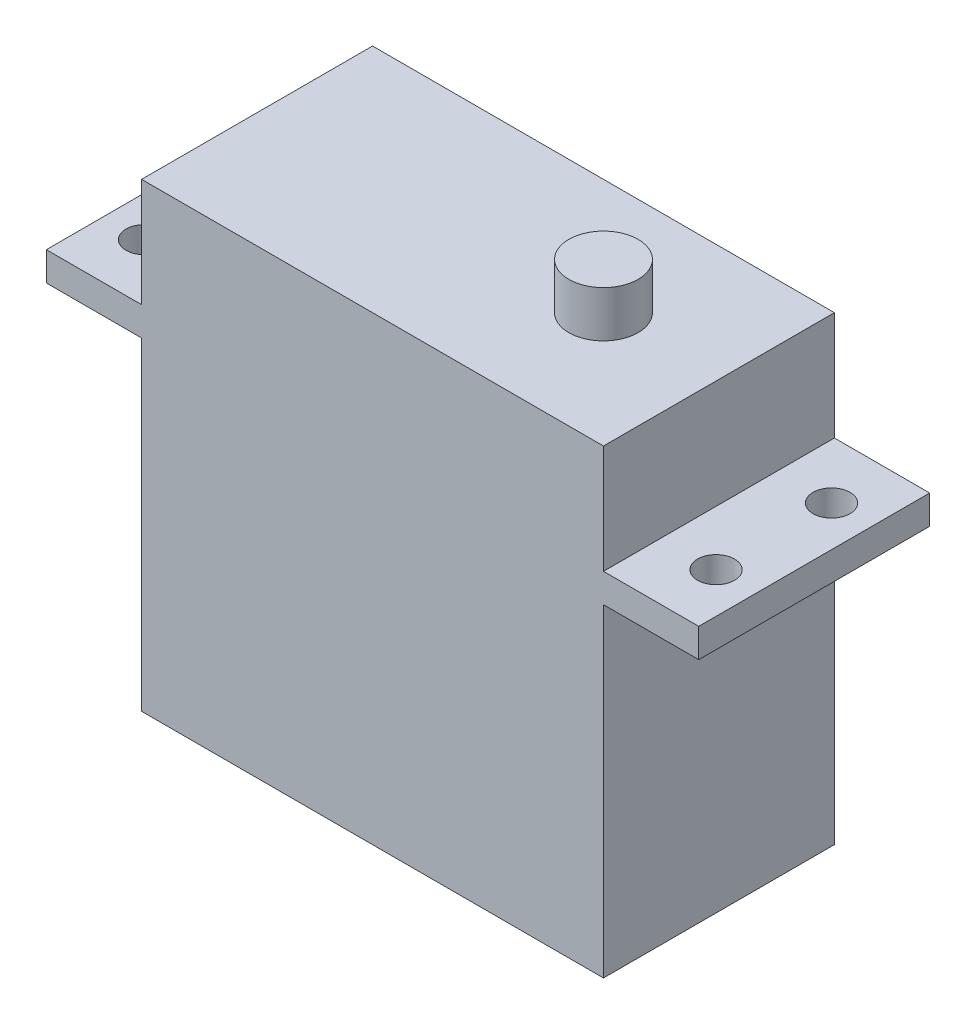
ISO-10303-21;
HEADER;
FILE_DESCRIPTION(('STEP AP214'),'2;1');
FILE_NAME('part.step','',(''),(''),'','','');
FILE_SCHEMA(('AUTOMOTIVE_DESIGN { 1 0 10303 214 1 1 1 1 }'));
ENDSEC;
DATA;
#1=APPLICATION_CONTEXT('core data for automotive mechanical design processes');
#2=APPLICATION_PROTOCOL_DEFINITION('international standard','automotive_design',2000,#1);
#3=PRODUCT_CONTEXT('',#1,'mechanical');
#4=PRODUCT('Part','Part','',(#3));
#5=PRODUCT_RELATED_PRODUCT_CATEGORY('part','',(#4));
#6=PRODUCT_DEFINITION_FORMATION('','',#4);
#7=PRODUCT_DEFINITION_CONTEXT('part definition',#1,'design');
#8=PRODUCT_DEFINITION('design','',#6,#7);
#9=PRODUCT_DEFINITION_SHAPE('','',#8);
#10=(LENGTH_UNIT() NAMED_UNIT(*) SI_UNIT(.MILLI.,.METRE.));
#11=(NAMED_UNIT(*) PLANE_ANGLE_UNIT() SI_UNIT($,.RADIAN.));
#12=(NAMED_UNIT(*) SI_UNIT($,.STERADIAN.) SOLID_ANGLE_UNIT());
#13=UNCERTAINTY_MEASURE_WITH_UNIT(LENGTH_MEASURE(1.E-05),#10,'distance_accuracy_value','');
#14=(GEOMETRIC_REPRESENTATION_CONTEXT(3) GLOBAL_UNCERTAINTY_ASSIGNED_CONTEXT((#13)) GLOBAL_UNIT_ASSIGNED_CONTEXT((#10,
#11,#12)) REPRESENTATION_CONTEXT('',''));
#15=CARTESIAN_POINT('',(0.,0.,0.));
#16=DIRECTION('',(0.,0.,1.));
#17=DIRECTION('',(1.,0.,0.));
#18=AXIS2_PLACEMENT_3D('',#15,#16,#17);
#19=CARTESIAN_POINT('',(-30.,57.5,34.));
#20=DIRECTION('',(1.,0.,0.));
#21=DIRECTION('',(0.,0.,-1.));
#22=AXIS2_PLACEMENT_3D('',#19,#20,#21);
#23=PLANE('',#22);
#24=DIRECTION('',(0.,0.,-1.));
#25=VECTOR('',#24,1.);
#26=CARTESIAN_POINT('',(-30.,48.1,34.));
#27=LINE('',#26,#25);
#28=CARTESIAN_POINT('',(-30.,48.1,34.));
#29=VERTEX_POINT('',#28);
#30=CARTESIAN_POINT('',(-30.,48.1,14.));
#31=VERTEX_POINT('',#30);
#32=EDGE_CURVE('E157',#29,#31,#27,.T.);
#33=ORIENTED_EDGE('',*,*,#32,.F.);
#34=DIRECTION('',(0.,-1.,0.));
#35=VECTOR('',#34,1.);
#36=CARTESIAN_POINT('',(-30.,57.5,34.));
#37=LINE('',#36,#35);
#38=CARTESIAN_POINT('',(-30.,57.5,34.));
#39=VERTEX_POINT('',#38);
#40=EDGE_CURVE('E183',#39,#29,#37,.T.);
#41=ORIENTED_EDGE('',*,*,#40,.F.);
#42=DIRECTION('',(0.,0.,-1.));
#43=VECTOR('',#42,1.);
#44=CARTESIAN_POINT('',(-30.,57.5,34.));
#45=LINE('',#44,#43);
#46=CARTESIAN_POINT('',(-30.,57.5,14.));
#47=VERTEX_POINT('',#46);
#48=EDGE_CURVE('E192',#39,#47,#45,.T.);
#49=ORIENTED_EDGE('',*,*,#48,.T.);
#50=DIRECTION('',(0.,-1.,0.));
#51=VECTOR('',#50,1.);
#52=CARTESIAN_POINT('',(-30.,57.5,14.));
#53=LINE('',#52,#51);
#54=EDGE_CURVE('E160',#47,#31,#53,.T.);
#55=ORIENTED_EDGE('',*,*,#54,.T.);
#56=EDGE_LOOP('',(#33,#41,#49,#55));
#57=FACE_BOUND('',#56,.T.);
#58=ADVANCED_FACE('F41',(#57),#23,.F.);
#59=CARTESIAN_POINT('',(10.,17.6,34.));
#60=DIRECTION('',(-1.,0.,0.));
#61=DIRECTION('',(0.,0.,1.));
#62=AXIS2_PLACEMENT_3D('',#59,#60,#61);
#63=PLANE('',#62);
#64=DIRECTION('',(0.,0.,-1.));
#65=VECTOR('',#64,1.);
#66=CARTESIAN_POINT('',(10.,45.6,34.));
#67=LINE('',#66,#65);
#68=CARTESIAN_POINT('',(10.,45.6,34.));
#69=VERTEX_POINT('',#68);
#70=CARTESIAN_POINT('',(10.,45.6,14.));
#71=VERTEX_POINT('',#70);
#72=EDGE_CURVE('E162',#69,#71,#67,.T.);
#73=ORIENTED_EDGE('',*,*,#72,.F.);
#74=DIRECTION('',(0.,1.,0.));
#75=VECTOR('',#74,1.);
#76=CARTESIAN_POINT('',(10.,17.6,34.));
#77=LINE('',#76,#75);
#78=CARTESIAN_POINT('',(10.,17.6,34.));
#79=VERTEX_POINT('',#78);
#80=EDGE_CURVE('E193',#79,#69,#77,.T.);
#81=ORIENTED_EDGE('',*,*,#80,.F.);
#82=DIRECTION('',(0.,0.,-1.));
#83=VECTOR('',#82,1.);
#84=CARTESIAN_POINT('',(10.,17.6,34.));
#85=LINE('',#84,#83);
#86=CARTESIAN_POINT('',(10.,17.6,14.));
#87=VERTEX_POINT('',#86);
#88=EDGE_CURVE('E49',#79,#87,#85,.T.);
#89=ORIENTED_EDGE('',*,*,#88,.T.);
#90=DIRECTION('',(0.,1.,0.));
#91=VECTOR('',#90,1.);
#92=CARTESIAN_POINT('',(10.,17.6,14.));
#93=LINE('',#92,#91);
#94=EDGE_CURVE('E203',#87,#71,#93,.T.);
#95=ORIENTED_EDGE('',*,*,#94,.T.);
#96=EDGE_LOOP('',(#73,#81,#89,#95));
#97=FACE_BOUND('',#96,.T.);
#98=ADVANCED_FACE('F278',(#97),#63,.F.);
#99=CARTESIAN_POINT('',(-30.,45.6,34.));
#100=VERTEX_POINT('',#99);
#101=CARTESIAN_POINT('',(-30.,17.6,34.));
#102=VERTEX_POINT('',#101);
#103=EDGE_CURVE('E186',#100,#102,#37,.T.);
#104=ORIENTED_EDGE('',*,*,#103,.F.);
#105=DIRECTION('',(0.,0.,-1.));
#106=VECTOR('',#105,1.);
#107=CARTESIAN_POINT('',(-30.,45.6,34.));
#108=LINE('',#107,#106);
#109=CARTESIAN_POINT('',(-30.,45.6,14.));
#110=VERTEX_POINT('',#109);
#111=EDGE_CURVE('E136',#100,#110,#108,.T.);
#112=ORIENTED_EDGE('',*,*,#111,.T.);
#113=CARTESIAN_POINT('',(-30.,17.6,14.));
#114=VERTEX_POINT('',#113);
#115=EDGE_CURVE('E154',#110,#114,#53,.T.);
#116=ORIENTED_EDGE('',*,*,#115,.T.);
#117=DIRECTION('',(0.,0.,-1.));
#118=VECTOR('',#117,1.);
#119=CARTESIAN_POINT('',(-30.,17.6,34.));
#120=LINE('',#119,#118);
#121=EDGE_CURVE('E11',#102,#114,#120,.T.);
#122=ORIENTED_EDGE('',*,*,#121,.F.);
#123=EDGE_LOOP('',(#104,#112,#116,#122));
#124=FACE_BOUND('',#123,.T.);
#125=ADVANCED_FACE('F43',(#124),#23,.F.);
#126=CARTESIAN_POINT('',(-30.,17.6,34.));
#127=DIRECTION('',(0.,1.,0.));
#128=DIRECTION('',(0.,0.,1.));
#129=AXIS2_PLACEMENT_3D('',#126,#127,#128);
#130=PLANE('',#129);
#131=DIRECTION('',(1.,0.,0.));
#132=VECTOR('',#131,1.);
#133=CARTESIAN_POINT('',(-30.,17.6,14.));
#134=LINE('',#133,#132);
#135=EDGE_CURVE('E196',#114,#87,#134,.T.);
#136=ORIENTED_EDGE('',*,*,#135,.T.);
#137=ORIENTED_EDGE('',*,*,#88,.F.);
#138=DIRECTION('',(1.,0.,0.));
#139=VECTOR('',#138,1.);
#140=CARTESIAN_POINT('',(-30.,17.6,34.));
#141=LINE('',#140,#139);
#142=EDGE_CURVE('E190',#102,#79,#141,.T.);
#143=ORIENTED_EDGE('',*,*,#142,.F.);
#144=ORIENTED_EDGE('',*,*,#121,.T.);
#145=EDGE_LOOP('',(#136,#137,#143,#144));
#146=FACE_BOUND('',#145,.T.);
#147=ADVANCED_FACE('F282',(#146),#130,.F.);
#148=CARTESIAN_POINT('',(10.,48.1,34.));
#149=VERTEX_POINT('',#148);
#150=CARTESIAN_POINT('',(10.,57.5,34.));
#151=VERTEX_POINT('',#150);
#152=EDGE_CURVE('E189',#149,#151,#77,.T.);
#153=ORIENTED_EDGE('',*,*,#152,.F.);
#154=DIRECTION('',(0.,0.,-1.));
#155=VECTOR('',#154,1.);
#156=CARTESIAN_POINT('',(10.,48.1,34.));
#157=LINE('',#156,#155);
#158=CARTESIAN_POINT('',(10.,48.1,14.));
#159=VERTEX_POINT('',#158);
#160=EDGE_CURVE('E175',#149,#159,#157,.T.);
#161=ORIENTED_EDGE('',*,*,#160,.T.);
#162=CARTESIAN_POINT('',(10.,57.5,14.));
#163=VERTEX_POINT('',#162);
#164=EDGE_CURVE('E199',#159,#163,#93,.T.);
#165=ORIENTED_EDGE('',*,*,#164,.T.);
#166=DIRECTION('',(0.,0.,-1.));
#167=VECTOR('',#166,1.);
#168=CARTESIAN_POINT('',(10.,57.5,34.));
#169=LINE('',#168,#167);
#170=EDGE_CURVE('E208',#151,#163,#169,.T.);
#171=ORIENTED_EDGE('',*,*,#170,.F.);
#172=EDGE_LOOP('',(#153,#161,#165,#171));
#173=FACE_BOUND('',#172,.T.);
#174=ADVANCED_FACE('F264',(#173),#63,.F.);
#175=CARTESIAN_POINT('',(10.,57.5,34.));
#176=DIRECTION('',(0.,-1.,0.));
#177=DIRECTION('',(0.,0.,-1.));
#178=AXIS2_PLACEMENT_3D('',#175,#176,#177);
#179=PLANE('',#178);
#180=CARTESIAN_POINT('',(0.,57.5,24.));
#181=DIRECTION('',(0.,-1.,0.));
#182=DIRECTION('',(0.,0.,-1.));
#183=AXIS2_PLACEMENT_3D('',#180,#181,#182);
#184=CIRCLE('',#183,3.);
#185=CARTESIAN_POINT('',(0.,57.5,21.));
#186=VERTEX_POINT('',#185);
#187=EDGE_CURVE('E170',#186,#186,#184,.T.);
#188=ORIENTED_EDGE('',*,*,#187,.T.);
#189=EDGE_LOOP('',(#188));
#190=FACE_BOUND('',#189,.T.);
#191=DIRECTION('',(-1.,0.,0.));
#192=VECTOR('',#191,1.);
#193=CARTESIAN_POINT('',(10.,57.5,14.));
#194=LINE('',#193,#192);
#195=EDGE_CURVE('E204',#163,#47,#194,.T.);
#196=ORIENTED_EDGE('',*,*,#195,.T.);
#197=ORIENTED_EDGE('',*,*,#48,.F.);
#198=DIRECTION('',(-1.,0.,0.));
#199=VECTOR('',#198,1.);
#200=CARTESIAN_POINT('',(10.,57.5,34.));
#201=LINE('',#200,#199);
#202=EDGE_CURVE('E194',#151,#39,#201,.T.);
#203=ORIENTED_EDGE('',*,*,#202,.F.);
#204=ORIENTED_EDGE('',*,*,#170,.T.);
#205=EDGE_LOOP('',(#196,#197,#203,#204));
#206=FACE_BOUND('',#205,.T.);
#207=ADVANCED_FACE('F259',(#190,#206),#179,.F.);
#208=CARTESIAN_POINT('',(0.,0.,34.));
#209=DIRECTION('',(0.,0.,1.));
#210=DIRECTION('',(1.,0.,0.));
#211=AXIS2_PLACEMENT_3D('',#208,#209,#210);
#212=PLANE('',#211);
#213=ORIENTED_EDGE('',*,*,#40,.T.);
#214=DIRECTION('',(-1.,0.,0.));
#215=VECTOR('',#214,1.);
#216=CARTESIAN_POINT('',(-30.,48.1,34.));
#217=LINE('',#216,#215);
#218=CARTESIAN_POINT('',(-38.25,48.1,34.));
#219=VERTEX_POINT('',#218);
#220=EDGE_CURVE('E143',#29,#219,#217,.T.);
#221=ORIENTED_EDGE('',*,*,#220,.T.);
#222=DIRECTION('',(0.,-1.,0.));
#223=VECTOR('',#222,1.);
#224=CARTESIAN_POINT('',(-38.25,48.1,34.));
#225=LINE('',#224,#223);
#226=CARTESIAN_POINT('',(-38.25,45.6,34.));
#227=VERTEX_POINT('',#226);
#228=EDGE_CURVE('E142',#219,#227,#225,.T.);
#229=ORIENTED_EDGE('',*,*,#228,.T.);
#230=DIRECTION('',(1.,0.,0.));
#231=VECTOR('',#230,1.);
#232=CARTESIAN_POINT('',(-38.25,45.6,34.));
#233=LINE('',#232,#231);
#234=EDGE_CURVE('E135',#227,#100,#233,.T.);
#235=ORIENTED_EDGE('',*,*,#234,.T.);
#236=ORIENTED_EDGE('',*,*,#103,.T.);
#237=ORIENTED_EDGE('',*,*,#142,.T.);
#238=ORIENTED_EDGE('',*,*,#80,.T.);
#239=DIRECTION('',(1.,0.,0.));
#240=VECTOR('',#239,1.);
#241=CARTESIAN_POINT('',(10.,45.6,34.));
#242=LINE('',#241,#240);
#243=CARTESIAN_POINT('',(18.25,45.6,34.));
#244=VERTEX_POINT('',#243);
#245=EDGE_CURVE('E180',#69,#244,#242,.T.);
#246=ORIENTED_EDGE('',*,*,#245,.T.);
#247=DIRECTION('',(0.,1.,0.));
#248=VECTOR('',#247,1.);
#249=CARTESIAN_POINT('',(18.25,45.6,34.));
#250=LINE('',#249,#248);
#251=CARTESIAN_POINT('',(18.25,48.1,34.));
#252=VERTEX_POINT('',#251);
#253=EDGE_CURVE('E185',#244,#252,#250,.T.);
#254=ORIENTED_EDGE('',*,*,#253,.T.);
#255=DIRECTION('',(-1.,0.,0.));
#256=VECTOR('',#255,1.);
#257=CARTESIAN_POINT('',(18.25,48.1,34.));
#258=LINE('',#257,#256);
#259=EDGE_CURVE('E172',#252,#149,#258,.T.);
#260=ORIENTED_EDGE('',*,*,#259,.T.);
#261=ORIENTED_EDGE('',*,*,#152,.T.);
#262=ORIENTED_EDGE('',*,*,#202,.T.);
#263=EDGE_LOOP('',(#213,#221,#229,#235,#236,#237,#238,#246,#254,#260,#261,#262));
#264=FACE_BOUND('',#263,.T.);
#265=ADVANCED_FACE('F148',(#264),#212,.T.);
#266=CARTESIAN_POINT('',(0.,0.,14.));
#267=DIRECTION('',(0.,0.,1.));
#268=DIRECTION('',(1.,0.,0.));
#269=AXIS2_PLACEMENT_3D('',#266,#267,#268);
#270=PLANE('',#269);
#271=ORIENTED_EDGE('',*,*,#54,.F.);
#272=ORIENTED_EDGE('',*,*,#195,.F.);
#273=ORIENTED_EDGE('',*,*,#164,.F.);
#274=DIRECTION('',(-1.,0.,0.));
#275=VECTOR('',#274,1.);
#276=CARTESIAN_POINT('',(18.25,48.1,14.));
#277=LINE('',#276,#275);
#278=CARTESIAN_POINT('',(18.25,48.1,14.));
#279=VERTEX_POINT('',#278);
#280=EDGE_CURVE('E68',#279,#159,#277,.T.);
#281=ORIENTED_EDGE('',*,*,#280,.F.);
#282=DIRECTION('',(0.,1.,0.));
#283=VECTOR('',#282,1.);
#284=CARTESIAN_POINT('',(18.25,45.6,14.));
#285=LINE('',#284,#283);
#286=CARTESIAN_POINT('',(18.25,45.6,14.));
#287=VERTEX_POINT('',#286);
#288=EDGE_CURVE('E178',#287,#279,#285,.T.);
#289=ORIENTED_EDGE('',*,*,#288,.F.);
#290=DIRECTION('',(1.,0.,0.));
#291=VECTOR('',#290,1.);
#292=CARTESIAN_POINT('',(10.,45.6,14.));
#293=LINE('',#292,#291);
#294=EDGE_CURVE('E179',#71,#287,#293,.T.);
#295=ORIENTED_EDGE('',*,*,#294,.F.);
#296=ORIENTED_EDGE('',*,*,#94,.F.);
#297=ORIENTED_EDGE('',*,*,#135,.F.);
#298=ORIENTED_EDGE('',*,*,#115,.F.);
#299=DIRECTION('',(1.,0.,0.));
#300=VECTOR('',#299,1.);
#301=CARTESIAN_POINT('',(-38.25,45.6,14.));
#302=LINE('',#301,#300);
#303=CARTESIAN_POINT('',(-38.25,45.6,14.));
#304=VERTEX_POINT('',#303);
#305=EDGE_CURVE('E59',#304,#110,#302,.T.);
#306=ORIENTED_EDGE('',*,*,#305,.F.);
#307=DIRECTION('',(0.,-1.,0.));
#308=VECTOR('',#307,1.);
#309=CARTESIAN_POINT('',(-38.25,48.1,14.));
#310=LINE('',#309,#308);
#311=CARTESIAN_POINT('',(-38.25,48.1,14.));
#312=VERTEX_POINT('',#311);
#313=EDGE_CURVE('E152',#312,#304,#310,.T.);
#314=ORIENTED_EDGE('',*,*,#313,.F.);
#315=DIRECTION('',(-1.,0.,0.));
#316=VECTOR('',#315,1.);
#317=CARTESIAN_POINT('',(-30.,48.1,14.));
#318=LINE('',#317,#316);
#319=EDGE_CURVE('E147',#31,#312,#318,.T.);
#320=ORIENTED_EDGE('',*,*,#319,.F.);
#321=EDGE_LOOP('',(#271,#272,#273,#281,#289,#295,#296,#297,#298,#306,#314,#320));
#322=FACE_BOUND('',#321,.T.);
#323=ADVANCED_FACE('F255',(#322),#270,.F.);
#324=CARTESIAN_POINT('',(10.,45.6,34.));
#325=DIRECTION('',(0.,1.,0.));
#326=DIRECTION('',(0.,0.,1.));
#327=AXIS2_PLACEMENT_3D('',#324,#325,#326);
#328=PLANE('',#327);
#329=CARTESIAN_POINT('',(14.75,45.6,19.));
#330=DIRECTION('',(0.,1.,0.));
#331=DIRECTION('',(0.,0.,1.));
#332=AXIS2_PLACEMENT_3D('',#329,#330,#331);
#333=CIRCLE('',#332,1.6);
#334=CARTESIAN_POINT('',(14.75,45.6,20.6));
#335=VERTEX_POINT('',#334);
#336=EDGE_CURVE('E231',#335,#335,#333,.T.);
#337=ORIENTED_EDGE('',*,*,#336,.T.);
#338=EDGE_LOOP('',(#337));
#339=FACE_BOUND('',#338,.T.);
#340=CARTESIAN_POINT('',(14.75,45.6,29.));
#341=DIRECTION('',(0.,1.,0.));
#342=DIRECTION('',(0.,0.,1.));
#343=AXIS2_PLACEMENT_3D('',#340,#341,#342);
#344=CIRCLE('',#343,1.6);
#345=CARTESIAN_POINT('',(14.75,45.6,30.6));
#346=VERTEX_POINT('',#345);
#347=EDGE_CURVE('E225',#346,#346,#344,.T.);
#348=ORIENTED_EDGE('',*,*,#347,.T.);
#349=EDGE_LOOP('',(#348));
#350=FACE_BOUND('',#349,.T.);
#351=ORIENTED_EDGE('',*,*,#294,.T.);
#352=DIRECTION('',(0.,0.,-1.));
#353=VECTOR('',#352,1.);
#354=CARTESIAN_POINT('',(18.25,45.6,34.));
#355=LINE('',#354,#353);
#356=EDGE_CURVE('E167',#244,#287,#355,.T.);
#357=ORIENTED_EDGE('',*,*,#356,.F.);
#358=ORIENTED_EDGE('',*,*,#245,.F.);
#359=ORIENTED_EDGE('',*,*,#72,.T.);
#360=EDGE_LOOP('',(#351,#357,#358,#359));
#361=FACE_BOUND('',#360,.T.);
#362=ADVANCED_FACE('F280',(#339,#350,#361),#328,.F.);
#363=CARTESIAN_POINT('',(18.25,45.6,34.));
#364=DIRECTION('',(-1.,0.,0.));
#365=DIRECTION('',(0.,0.,1.));
#366=AXIS2_PLACEMENT_3D('',#363,#364,#365);
#367=PLANE('',#366);
#368=ORIENTED_EDGE('',*,*,#288,.T.);
#369=DIRECTION('',(0.,0.,-1.));
#370=VECTOR('',#369,1.);
#371=CARTESIAN_POINT('',(18.25,48.1,34.));
#372=LINE('',#371,#370);
#373=EDGE_CURVE('E168',#252,#279,#372,.T.);
#374=ORIENTED_EDGE('',*,*,#373,.F.);
#375=ORIENTED_EDGE('',*,*,#253,.F.);
#376=ORIENTED_EDGE('',*,*,#356,.T.);
#377=EDGE_LOOP('',(#368,#374,#375,#376));
#378=FACE_BOUND('',#377,.T.);
#379=ADVANCED_FACE('F275',(#378),#367,.F.);
#380=CARTESIAN_POINT('',(18.25,48.1,34.));
#381=DIRECTION('',(0.,-1.,0.));
#382=DIRECTION('',(0.,0.,-1.));
#383=AXIS2_PLACEMENT_3D('',#380,#381,#382);
#384=PLANE('',#383);
#385=CARTESIAN_POINT('',(14.75,48.1,19.));
#386=DIRECTION('',(0.,-1.,0.));
#387=DIRECTION('',(0.,0.,-1.));
#388=AXIS2_PLACEMENT_3D('',#385,#386,#387);
#389=CIRCLE('',#388,1.6);
#390=CARTESIAN_POINT('',(14.75,48.1,17.4));
#391=VERTEX_POINT('',#390);
#392=EDGE_CURVE('E44',#391,#391,#389,.T.);
#393=ORIENTED_EDGE('',*,*,#392,.T.);
#394=EDGE_LOOP('',(#393));
#395=FACE_BOUND('',#394,.T.);
#396=CARTESIAN_POINT('',(14.75,48.1,29.));
#397=DIRECTION('',(0.,-1.,0.));
#398=DIRECTION('',(0.,0.,-1.));
#399=AXIS2_PLACEMENT_3D('',#396,#397,#398);
#400=CIRCLE('',#399,1.6);
#401=CARTESIAN_POINT('',(14.75,48.1,27.4));
#402=VERTEX_POINT('',#401);
#403=EDGE_CURVE('E219',#402,#402,#400,.T.);
#404=ORIENTED_EDGE('',*,*,#403,.T.);
#405=EDGE_LOOP('',(#404));
#406=FACE_BOUND('',#405,.T.);
#407=ORIENTED_EDGE('',*,*,#280,.T.);
#408=ORIENTED_EDGE('',*,*,#160,.F.);
#409=ORIENTED_EDGE('',*,*,#259,.F.);
#410=ORIENTED_EDGE('',*,*,#373,.T.);
#411=EDGE_LOOP('',(#407,#408,#409,#410));
#412=FACE_BOUND('',#411,.T.);
#413=ADVANCED_FACE('F270',(#395,#406,#412),#384,.F.);
#414=CARTESIAN_POINT('',(-38.25,48.1,34.));
#415=DIRECTION('',(1.,0.,0.));
#416=DIRECTION('',(0.,0.,-1.));
#417=AXIS2_PLACEMENT_3D('',#414,#415,#416);
#418=PLANE('',#417);
#419=ORIENTED_EDGE('',*,*,#313,.T.);
#420=DIRECTION('',(0.,0.,-1.));
#421=VECTOR('',#420,1.);
#422=CARTESIAN_POINT('',(-38.25,45.6,34.));
#423=LINE('',#422,#421);
#424=EDGE_CURVE('E138',#227,#304,#423,.T.);
#425=ORIENTED_EDGE('',*,*,#424,.F.);
#426=ORIENTED_EDGE('',*,*,#228,.F.);
#427=DIRECTION('',(0.,0.,-1.));
#428=VECTOR('',#427,1.);
#429=CARTESIAN_POINT('',(-38.25,48.1,34.));
#430=LINE('',#429,#428);
#431=EDGE_CURVE('E245',#219,#312,#430,.T.);
#432=ORIENTED_EDGE('',*,*,#431,.T.);
#433=EDGE_LOOP('',(#419,#425,#426,#432));
#434=FACE_BOUND('',#433,.T.);
#435=ADVANCED_FACE('F155',(#434),#418,.F.);
#436=CARTESIAN_POINT('',(-38.25,45.6,34.));
#437=DIRECTION('',(0.,1.,0.));
#438=DIRECTION('',(0.,0.,1.));
#439=AXIS2_PLACEMENT_3D('',#436,#437,#438);
#440=PLANE('',#439);
#441=CARTESIAN_POINT('',(-34.75,45.6,29.));
#442=DIRECTION('',(0.,1.,0.));
#443=DIRECTION('',(0.,0.,1.));
#444=AXIS2_PLACEMENT_3D('',#441,#442,#443);
#445=CIRCLE('',#444,1.6);
#446=CARTESIAN_POINT('',(-34.75,45.6,30.6));
#447=VERTEX_POINT('',#446);
#448=EDGE_CURVE('E218',#447,#447,#445,.T.);
#449=ORIENTED_EDGE('',*,*,#448,.T.);
#450=EDGE_LOOP('',(#449));
#451=FACE_BOUND('',#450,.T.);
#452=CARTESIAN_POINT('',(-34.75,45.6,19.));
#453=DIRECTION('',(0.,1.,0.));
#454=DIRECTION('',(0.,0.,1.));
#455=AXIS2_PLACEMENT_3D('',#452,#453,#454);
#456=CIRCLE('',#455,1.6);
#457=CARTESIAN_POINT('',(-34.75,45.6,20.6));
#458=VERTEX_POINT('',#457);
#459=EDGE_CURVE('E216',#458,#458,#456,.T.);
#460=ORIENTED_EDGE('',*,*,#459,.T.);
#461=EDGE_LOOP('',(#460));
#462=FACE_BOUND('',#461,.T.);
#463=ORIENTED_EDGE('',*,*,#305,.T.);
#464=ORIENTED_EDGE('',*,*,#111,.F.);
#465=ORIENTED_EDGE('',*,*,#234,.F.);
#466=ORIENTED_EDGE('',*,*,#424,.T.);
#467=EDGE_LOOP('',(#463,#464,#465,#466));
#468=FACE_BOUND('',#467,.T.);
#469=ADVANCED_FACE('F132',(#451,#462,#468),#440,.F.);
#470=CARTESIAN_POINT('',(-30.,48.1,34.));
#471=DIRECTION('',(0.,-1.,0.));
#472=DIRECTION('',(0.,0.,-1.));
#473=AXIS2_PLACEMENT_3D('',#470,#471,#472);
#474=PLANE('',#473);
#475=CARTESIAN_POINT('',(-34.75,48.1,29.));
#476=DIRECTION('',(0.,-1.,0.));
#477=DIRECTION('',(0.,0.,-1.));
#478=AXIS2_PLACEMENT_3D('',#475,#476,#477);
#479=CIRCLE('',#478,1.6);
#480=CARTESIAN_POINT('',(-34.75,48.1,27.4));
#481=VERTEX_POINT('',#480);
#482=EDGE_CURVE('E220',#481,#481,#479,.T.);
#483=ORIENTED_EDGE('',*,*,#482,.T.);
#484=EDGE_LOOP('',(#483));
#485=FACE_BOUND('',#484,.T.);
#486=CARTESIAN_POINT('',(-34.75,48.1,19.));
#487=DIRECTION('',(0.,-1.,0.));
#488=DIRECTION('',(0.,0.,-1.));
#489=AXIS2_PLACEMENT_3D('',#486,#487,#488);
#490=CIRCLE('',#489,1.6);
#491=CARTESIAN_POINT('',(-34.75,48.1,17.4));
#492=VERTEX_POINT('',#491);
#493=EDGE_CURVE('E213',#492,#492,#490,.T.);
#494=ORIENTED_EDGE('',*,*,#493,.T.);
#495=EDGE_LOOP('',(#494));
#496=FACE_BOUND('',#495,.T.);
#497=ORIENTED_EDGE('',*,*,#319,.T.);
#498=ORIENTED_EDGE('',*,*,#431,.F.);
#499=ORIENTED_EDGE('',*,*,#220,.F.);
#500=ORIENTED_EDGE('',*,*,#32,.T.);
#501=EDGE_LOOP('',(#497,#498,#499,#500));
#502=FACE_BOUND('',#501,.T.);
#503=ADVANCED_FACE('F249',(#485,#496,#502),#474,.F.);
#504=CARTESIAN_POINT('',(0.,-100.,24.));
#505=DIRECTION('',(0.,-1.,0.));
#506=DIRECTION('',(0.,0.,-1.));
#507=AXIS2_PLACEMENT_3D('',#504,#505,#506);
#508=CYLINDRICAL_SURFACE('',#507,3.);
#509=CARTESIAN_POINT('',(0.,61.5,24.));
#510=DIRECTION('',(0.,-1.,0.));
#511=DIRECTION('',(0.,0.,-1.));
#512=AXIS2_PLACEMENT_3D('',#509,#510,#511);
#513=CIRCLE('',#512,3.);
#514=CARTESIAN_POINT('',(0.,61.5,21.));
#515=VERTEX_POINT('',#514);
#516=EDGE_CURVE('E237',#515,#515,#513,.T.);
#517=ORIENTED_EDGE('',*,*,#516,.T.);
#518=EDGE_LOOP('',(#517));
#519=FACE_BOUND('',#518,.T.);
#520=ORIENTED_EDGE('',*,*,#187,.F.);
#521=EDGE_LOOP('',(#520));
#522=FACE_BOUND('',#521,.T.);
#523=ADVANCED_FACE('F398',(#519,#522),#508,.T.);
#524=CARTESIAN_POINT('',(3.,61.5,24.));
#525=DIRECTION('',(0.,1.,0.));
#526=DIRECTION('',(0.,0.,1.));
#527=AXIS2_PLACEMENT_3D('',#524,#525,#526);
#528=PLANE('',#527);
#529=ORIENTED_EDGE('',*,*,#516,.F.);
#530=EDGE_LOOP('',(#529));
#531=FACE_BOUND('',#530,.T.);
#532=ADVANCED_FACE('F408',(#531),#528,.T.);
#533=CARTESIAN_POINT('',(-34.75,-53.1,19.));
#534=DIRECTION('',(0.,1.,0.));
#535=DIRECTION('',(0.,0.,1.));
#536=AXIS2_PLACEMENT_3D('',#533,#534,#535);
#537=CYLINDRICAL_SURFACE('',#536,1.6);
#538=ORIENTED_EDGE('',*,*,#493,.F.);
#539=EDGE_LOOP('',(#538));
#540=FACE_BOUND('',#539,.T.);
#541=ORIENTED_EDGE('',*,*,#459,.F.);
#542=EDGE_LOOP('',(#541));
#543=FACE_BOUND('',#542,.T.);
#544=ADVANCED_FACE('F418',(#540,#543),#537,.F.);
#545=CARTESIAN_POINT('',(-34.75,-53.1,29.));
#546=DIRECTION('',(0.,1.,0.));
#547=DIRECTION('',(0.,0.,1.));
#548=AXIS2_PLACEMENT_3D('',#545,#546,#547);
#549=CYLINDRICAL_SURFACE('',#548,1.6);
#550=ORIENTED_EDGE('',*,*,#482,.F.);
#551=EDGE_LOOP('',(#550));
#552=FACE_BOUND('',#551,.T.);
#553=ORIENTED_EDGE('',*,*,#448,.F.);
#554=EDGE_LOOP('',(#553));
#555=FACE_BOUND('',#554,.T.);
#556=ADVANCED_FACE('F426',(#552,#555),#549,.F.);
#557=CARTESIAN_POINT('',(14.75,-53.1,29.));
#558=DIRECTION('',(0.,1.,0.));
#559=DIRECTION('',(0.,0.,1.));
#560=AXIS2_PLACEMENT_3D('',#557,#558,#559);
#561=CYLINDRICAL_SURFACE('',#560,1.6);
#562=ORIENTED_EDGE('',*,*,#403,.F.);
#563=EDGE_LOOP('',(#562));
#564=FACE_BOUND('',#563,.T.);
#565=ORIENTED_EDGE('',*,*,#347,.F.);
#566=EDGE_LOOP('',(#565));
#567=FACE_BOUND('',#566,.T.);
#568=ADVANCED_FACE('F436',(#564,#567),#561,.F.);
#569=CARTESIAN_POINT('',(14.75,-53.1,19.));
#570=DIRECTION('',(0.,1.,0.));
#571=DIRECTION('',(0.,0.,1.));
#572=AXIS2_PLACEMENT_3D('',#569,#570,#571);
#573=CYLINDRICAL_SURFACE('',#572,1.6);
#574=ORIENTED_EDGE('',*,*,#392,.F.);
#575=EDGE_LOOP('',(#574));
#576=FACE_BOUND('',#575,.T.);
#577=ORIENTED_EDGE('',*,*,#336,.F.);
#578=EDGE_LOOP('',(#577));
#579=FACE_BOUND('',#578,.T.);
#580=ADVANCED_FACE('F448',(#576,#579),#573,.F.);
#581=CLOSED_SHELL('',(#58,#98,#125,#147,#174,#207,#265,#323,#362,#379,#413,#435,#469,#503,#523,
#532,#544,#556,#568,#580));
#582=MANIFOLD_SOLID_BREP('B2',#581);
#583=ADVANCED_BREP_SHAPE_REPRESENTATION('',(#18,#582),#14);
#584=SHAPE_DEFINITION_REPRESENTATION(#9,#583);
ENDSEC;
END-ISO-10303-21;
